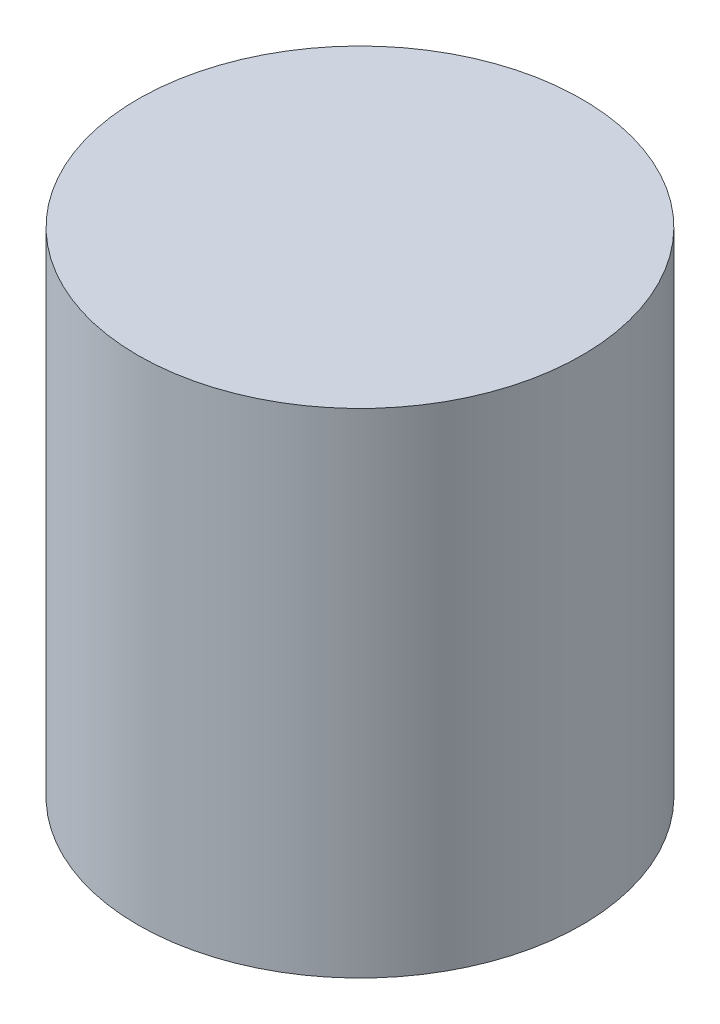
ISO-10303-21;
HEADER;
FILE_DESCRIPTION(('STEP AP214'),'2;1');
FILE_NAME('part.step','',(''),(''),'','','');
FILE_SCHEMA(('AUTOMOTIVE_DESIGN { 1 0 10303 214 1 1 1 1 }'));
ENDSEC;
DATA;
#1=APPLICATION_CONTEXT('core data for automotive mechanical design processes');
#2=APPLICATION_PROTOCOL_DEFINITION('international standard','automotive_design',2000,#1);
#3=PRODUCT_CONTEXT('',#1,'mechanical');
#4=PRODUCT('Part','Part','',(#3));
#5=PRODUCT_RELATED_PRODUCT_CATEGORY('part','',(#4));
#6=PRODUCT_DEFINITION_FORMATION('','',#4);
#7=PRODUCT_DEFINITION_CONTEXT('part definition',#1,'design');
#8=PRODUCT_DEFINITION('design','',#6,#7);
#9=PRODUCT_DEFINITION_SHAPE('','',#8);
#10=(LENGTH_UNIT() NAMED_UNIT(*) SI_UNIT(.MILLI.,.METRE.));
#11=(NAMED_UNIT(*) PLANE_ANGLE_UNIT() SI_UNIT($,.RADIAN.));
#12=(NAMED_UNIT(*) SI_UNIT($,.STERADIAN.) SOLID_ANGLE_UNIT());
#13=UNCERTAINTY_MEASURE_WITH_UNIT(LENGTH_MEASURE(1.E-05),#10,'distance_accuracy_value','');
#14=(GEOMETRIC_REPRESENTATION_CONTEXT(3) GLOBAL_UNCERTAINTY_ASSIGNED_CONTEXT((#13)) GLOBAL_UNIT_ASSIGNED_CONTEXT((#10,
#11,#12)) REPRESENTATION_CONTEXT('',''));
#15=CARTESIAN_POINT('',(0.,0.,0.));
#16=DIRECTION('',(0.,0.,1.));
#17=DIRECTION('',(1.,0.,0.));
#18=AXIS2_PLACEMENT_3D('',#15,#16,#17);
#19=CARTESIAN_POINT('',(0.,20.,0.));
#20=DIRECTION('',(0.,-1.,0.));
#21=DIRECTION('',(0.,0.,-1.));
#22=AXIS2_PLACEMENT_3D('',#19,#20,#21);
#23=CYLINDRICAL_SURFACE('',#22,9.);
#24=CARTESIAN_POINT('',(0.,20.,0.));
#25=DIRECTION('',(0.,1.,0.));
#26=DIRECTION('',(0.,0.,1.));
#27=AXIS2_PLACEMENT_3D('',#24,#25,#26);
#28=CIRCLE('',#27,9.);
#29=CARTESIAN_POINT('',(0.,20.,9.));
#30=VERTEX_POINT('',#29);
#31=EDGE_CURVE('E10',#30,#30,#28,.T.);
#32=ORIENTED_EDGE('',*,*,#31,.F.);
#33=EDGE_LOOP('',(#32));
#34=FACE_BOUND('',#33,.T.);
#35=CARTESIAN_POINT('',(0.,0.,0.));
#36=DIRECTION('',(0.,1.,0.));
#37=DIRECTION('',(0.,0.,1.));
#38=AXIS2_PLACEMENT_3D('',#35,#36,#37);
#39=CIRCLE('',#38,9.);
#40=CARTESIAN_POINT('',(0.,0.,9.));
#41=VERTEX_POINT('',#40);
#42=EDGE_CURVE('E36',#41,#41,#39,.T.);
#43=ORIENTED_EDGE('',*,*,#42,.T.);
#44=EDGE_LOOP('',(#43));
#45=FACE_BOUND('',#44,.T.);
#46=ADVANCED_FACE('F33',(#34,#45),#23,.T.);
#47=CARTESIAN_POINT('',(0.,20.,0.));
#48=DIRECTION('',(0.,1.,0.));
#49=DIRECTION('',(0.,0.,1.));
#50=AXIS2_PLACEMENT_3D('',#47,#48,#49);
#51=PLANE('',#50);
#52=ORIENTED_EDGE('',*,*,#31,.T.);
#53=EDGE_LOOP('',(#52));
#54=FACE_BOUND('',#53,.T.);
#55=ADVANCED_FACE('F48',(#54),#51,.T.);
#56=CARTESIAN_POINT('',(0.,0.,0.));
#57=DIRECTION('',(0.,1.,0.));
#58=DIRECTION('',(0.,0.,1.));
#59=AXIS2_PLACEMENT_3D('',#56,#57,#58);
#60=PLANE('',#59);
#61=ORIENTED_EDGE('',*,*,#42,.F.);
#62=EDGE_LOOP('',(#61));
#63=FACE_BOUND('',#62,.T.);
#64=ADVANCED_FACE('F46',(#63),#60,.F.);
#65=CLOSED_SHELL('',(#46,#55,#64));
#66=MANIFOLD_SOLID_BREP('B2',#65);
#67=ADVANCED_BREP_SHAPE_REPRESENTATION('',(#18,#66),#14);
#68=SHAPE_DEFINITION_REPRESENTATION(#9,#67);
ENDSEC;
END-ISO-10303-21;
